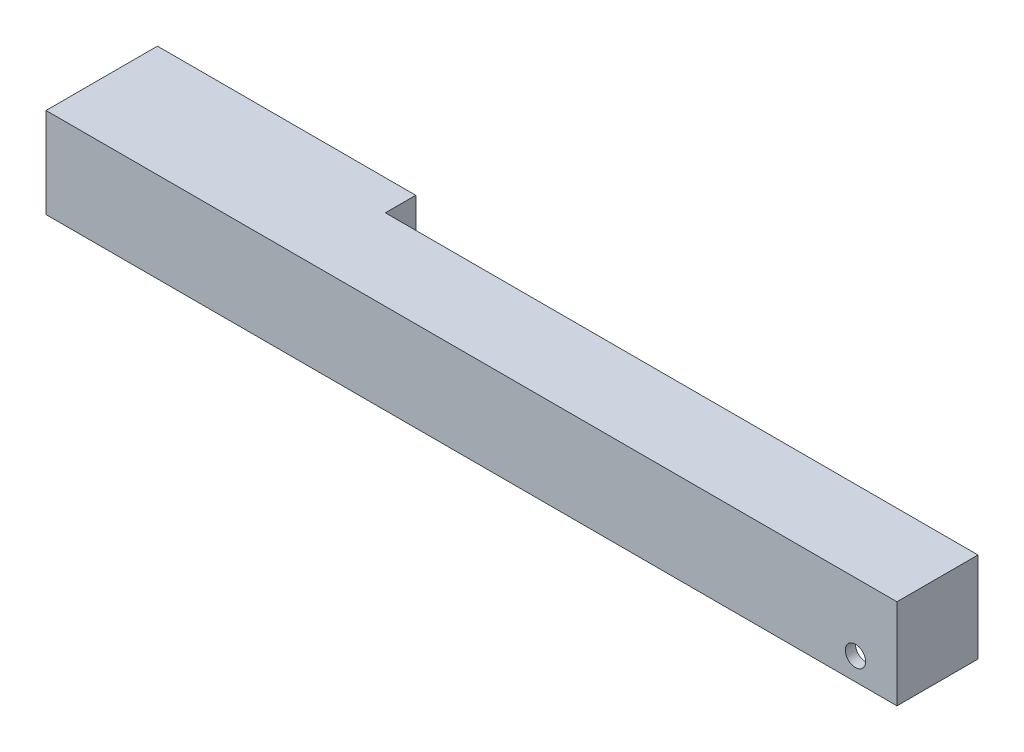
ISO-10303-21;
HEADER;
FILE_DESCRIPTION(('STEP AP214'),'2;1');
FILE_NAME('part.step','',(''),(''),'','','');
FILE_SCHEMA(('AUTOMOTIVE_DESIGN { 1 0 10303 214 1 1 1 1 }'));
ENDSEC;
DATA;
#1=APPLICATION_CONTEXT('core data for automotive mechanical design processes');
#2=APPLICATION_PROTOCOL_DEFINITION('international standard','automotive_design',2000,#1);
#3=PRODUCT_CONTEXT('',#1,'mechanical');
#4=PRODUCT('Part','Part','',(#3));
#5=PRODUCT_RELATED_PRODUCT_CATEGORY('part','',(#4));
#6=PRODUCT_DEFINITION_FORMATION('','',#4);
#7=PRODUCT_DEFINITION_CONTEXT('part definition',#1,'design');
#8=PRODUCT_DEFINITION('design','',#6,#7);
#9=PRODUCT_DEFINITION_SHAPE('','',#8);
#10=(LENGTH_UNIT() NAMED_UNIT(*) SI_UNIT(.MILLI.,.METRE.));
#11=(NAMED_UNIT(*) PLANE_ANGLE_UNIT() SI_UNIT($,.RADIAN.));
#12=(NAMED_UNIT(*) SI_UNIT($,.STERADIAN.) SOLID_ANGLE_UNIT());
#13=UNCERTAINTY_MEASURE_WITH_UNIT(LENGTH_MEASURE(1.E-05),#10,'distance_accuracy_value','');
#14=(GEOMETRIC_REPRESENTATION_CONTEXT(3) GLOBAL_UNCERTAINTY_ASSIGNED_CONTEXT((#13)) GLOBAL_UNIT_ASSIGNED_CONTEXT((#10,
#11,#12)) REPRESENTATION_CONTEXT('',''));
#15=CARTESIAN_POINT('',(0.,0.,0.));
#16=DIRECTION('',(0.,0.,1.));
#17=DIRECTION('',(1.,0.,0.));
#18=AXIS2_PLACEMENT_3D('',#15,#16,#17);
#19=CARTESIAN_POINT('',(82.,164.984847789123,9.));
#20=DIRECTION('',(0.,0.,1.));
#21=DIRECTION('',(1.,0.,0.));
#22=AXIS2_PLACEMENT_3D('',#19,#20,#21);
#23=PLANE('',#22);
#24=CARTESIAN_POINT('',(75.8000000000001,-13.35,9.));
#25=DIRECTION('',(0.,0.,1.));
#26=DIRECTION('',(1.,0.,0.));
#27=AXIS2_PLACEMENT_3D('',#24,#25,#26);
#28=CIRCLE('',#27,2.);
#29=CARTESIAN_POINT('',(77.8000000000001,-13.35,9.));
#30=VERTEX_POINT('',#29);
#31=EDGE_CURVE('E204',#30,#30,#28,.F.);
#32=ORIENTED_EDGE('',*,*,#31,.F.);
#33=EDGE_LOOP('',(#32));
#34=FACE_BOUND('',#33,.T.);
#35=DIRECTION('',(1.,0.,0.));
#36=VECTOR('',#35,1.);
#37=CARTESIAN_POINT('',(-82.,-14.3,8.99999999999998));
#38=LINE('',#37,#36);
#39=CARTESIAN_POINT('',(-82.,-14.3,8.99999999999998));
#40=VERTEX_POINT('',#39);
#41=CARTESIAN_POINT('',(-35.,-14.3,8.99999999999999));
#42=VERTEX_POINT('',#41);
#43=EDGE_CURVE('E63',#40,#42,#38,.T.);
#44=ORIENTED_EDGE('',*,*,#43,.T.);
#45=DIRECTION('',(0.,1.,0.));
#46=VECTOR('',#45,1.);
#47=CARTESIAN_POINT('',(-35.,-12.3,8.99999999999999));
#48=LINE('',#47,#46);
#49=CARTESIAN_POINT('',(-35.,-12.3,8.99999999999999));
#50=VERTEX_POINT('',#49);
#51=EDGE_CURVE('E67',#42,#50,#48,.T.);
#52=ORIENTED_EDGE('',*,*,#51,.T.);
#53=DIRECTION('',(-1.,0.,0.));
#54=VECTOR('',#53,1.);
#55=CARTESIAN_POINT('',(-82.,-12.3,8.99999999999998));
#56=LINE('',#55,#54);
#57=CARTESIAN_POINT('',(-82.,-12.3,8.99999999999998));
#58=VERTEX_POINT('',#57);
#59=EDGE_CURVE('E187',#50,#58,#56,.T.);
#60=ORIENTED_EDGE('',*,*,#59,.T.);
#61=DIRECTION('',(0.,-1.,0.));
#62=VECTOR('',#61,1.);
#63=CARTESIAN_POINT('',(-82.,164.984847789123,8.99999999999998));
#64=LINE('',#63,#62);
#65=CARTESIAN_POINT('',(-82.,-2.,8.99999999999998));
#66=VERTEX_POINT('',#65);
#67=EDGE_CURVE('E208',#66,#58,#64,.T.);
#68=ORIENTED_EDGE('',*,*,#67,.F.);
#69=DIRECTION('',(-1.,0.,0.));
#70=VECTOR('',#69,1.);
#71=CARTESIAN_POINT('',(82.,-2.,9.));
#72=LINE('',#71,#70);
#73=CARTESIAN_POINT('',(82.,-2.,9.));
#74=VERTEX_POINT('',#73);
#75=EDGE_CURVE('E297',#74,#66,#72,.T.);
#76=ORIENTED_EDGE('',*,*,#75,.F.);
#77=DIRECTION('',(0.,-1.,0.));
#78=VECTOR('',#77,1.);
#79=CARTESIAN_POINT('',(82.,164.984847789123,9.));
#80=LINE('',#79,#78);
#81=CARTESIAN_POINT('',(82.,-17.8,9.));
#82=VERTEX_POINT('',#81);
#83=EDGE_CURVE('E293',#74,#82,#80,.T.);
#84=ORIENTED_EDGE('',*,*,#83,.T.);
#85=DIRECTION('',(-1.,0.,0.));
#86=VECTOR('',#85,1.);
#87=CARTESIAN_POINT('',(82.,-17.8,9.));
#88=LINE('',#87,#86);
#89=CARTESIAN_POINT('',(-82.,-17.8,8.99999999999998));
#90=VERTEX_POINT('',#89);
#91=EDGE_CURVE('E316',#82,#90,#88,.T.);
#92=ORIENTED_EDGE('',*,*,#91,.T.);
#93=EDGE_CURVE('E278',#40,#90,#64,.T.);
#94=ORIENTED_EDGE('',*,*,#93,.F.);
#95=EDGE_LOOP('',(#44,#52,#60,#68,#76,#84,#92,#94));
#96=FACE_BOUND('',#95,.T.);
#97=ADVANCED_FACE('F47',(#34,#96),#23,.F.);
#98=CARTESIAN_POINT('',(-82.,164.984847789123,8.99999999999998));
#99=DIRECTION('',(-1.,0.,0.));
#100=DIRECTION('',(0.,0.,1.));
#101=AXIS2_PLACEMENT_3D('',#98,#99,#100);
#102=PLANE('',#101);
#103=DIRECTION('',(0.,0.,-1.));
#104=VECTOR('',#103,1.);
#105=CARTESIAN_POINT('',(-82.,-14.3,56.0425339453563));
#106=LINE('',#105,#104);
#107=CARTESIAN_POINT('',(-82.,-14.3,-9.));
#108=VERTEX_POINT('',#107);
#109=EDGE_CURVE('E341',#40,#108,#106,.T.);
#110=ORIENTED_EDGE('',*,*,#109,.F.);
#111=ORIENTED_EDGE('',*,*,#93,.T.);
#112=DIRECTION('',(0.,0.,-1.));
#113=VECTOR('',#112,1.);
#114=CARTESIAN_POINT('',(-82.,-17.8,8.99999999999998));
#115=LINE('',#114,#113);
#116=CARTESIAN_POINT('',(-82.,-17.8,-9.));
#117=VERTEX_POINT('',#116);
#118=EDGE_CURVE('E320',#90,#117,#115,.T.);
#119=ORIENTED_EDGE('',*,*,#118,.T.);
#120=DIRECTION('',(0.,-1.,0.));
#121=VECTOR('',#120,1.);
#122=CARTESIAN_POINT('',(-82.,164.984847789123,-9.));
#123=LINE('',#122,#121);
#124=EDGE_CURVE('E281',#108,#117,#123,.T.);
#125=ORIENTED_EDGE('',*,*,#124,.F.);
#126=EDGE_LOOP('',(#110,#111,#119,#125));
#127=FACE_BOUND('',#126,.T.);
#128=ADVANCED_FACE('F368',(#127),#102,.F.);
#129=DIRECTION('',(0.,0.,-1.));
#130=VECTOR('',#129,1.);
#131=CARTESIAN_POINT('',(-82.,-12.3,56.0425339453563));
#132=LINE('',#131,#130);
#133=CARTESIAN_POINT('',(-82.,-12.3,-9.));
#134=VERTEX_POINT('',#133);
#135=EDGE_CURVE('E338',#58,#134,#132,.T.);
#136=ORIENTED_EDGE('',*,*,#135,.T.);
#137=CARTESIAN_POINT('',(-82.,-2.,-9.));
#138=VERTEX_POINT('',#137);
#139=EDGE_CURVE('E183',#138,#134,#123,.T.);
#140=ORIENTED_EDGE('',*,*,#139,.F.);
#141=DIRECTION('',(0.,0.,-1.));
#142=VECTOR('',#141,1.);
#143=CARTESIAN_POINT('',(-82.,-2.,8.99999999999998));
#144=LINE('',#143,#142);
#145=EDGE_CURVE('E311',#66,#138,#144,.T.);
#146=ORIENTED_EDGE('',*,*,#145,.F.);
#147=ORIENTED_EDGE('',*,*,#67,.T.);
#148=EDGE_LOOP('',(#136,#140,#146,#147));
#149=FACE_BOUND('',#148,.T.);
#150=ADVANCED_FACE('F395',(#149),#102,.F.);
#151=CARTESIAN_POINT('',(-82.,164.984847789123,-9.));
#152=DIRECTION('',(0.,0.,-1.));
#153=DIRECTION('',(-1.,0.,0.));
#154=AXIS2_PLACEMENT_3D('',#151,#152,#153);
#155=PLANE('',#154);
#156=DIRECTION('',(1.,0.,0.));
#157=VECTOR('',#156,1.);
#158=CARTESIAN_POINT('',(-82.,-14.3,-9.));
#159=LINE('',#158,#157);
#160=CARTESIAN_POINT('',(-35.,-14.3,-9.));
#161=VERTEX_POINT('',#160);
#162=EDGE_CURVE('E348',#108,#161,#159,.T.);
#163=ORIENTED_EDGE('',*,*,#162,.F.);
#164=ORIENTED_EDGE('',*,*,#124,.T.);
#165=DIRECTION('',(1.,0.,0.));
#166=VECTOR('',#165,1.);
#167=CARTESIAN_POINT('',(-82.,-17.8,-9.));
#168=LINE('',#167,#166);
#169=CARTESIAN_POINT('',(-35.,-17.8,-9.));
#170=VERTEX_POINT('',#169);
#171=EDGE_CURVE('E324',#117,#170,#168,.T.);
#172=ORIENTED_EDGE('',*,*,#171,.T.);
#173=DIRECTION('',(0.,-1.,0.));
#174=VECTOR('',#173,1.);
#175=CARTESIAN_POINT('',(-35.,164.984847789123,-9.));
#176=LINE('',#175,#174);
#177=EDGE_CURVE('E176',#161,#170,#176,.T.);
#178=ORIENTED_EDGE('',*,*,#177,.F.);
#179=EDGE_LOOP('',(#163,#164,#172,#178));
#180=FACE_BOUND('',#179,.T.);
#181=ADVANCED_FACE('F366',(#180),#155,.F.);
#182=DIRECTION('',(-1.,0.,0.));
#183=VECTOR('',#182,1.);
#184=CARTESIAN_POINT('',(-82.,-12.3,-9.));
#185=LINE('',#184,#183);
#186=CARTESIAN_POINT('',(-35.,-12.3,-9.));
#187=VERTEX_POINT('',#186);
#188=EDGE_CURVE('E180',#187,#134,#185,.T.);
#189=ORIENTED_EDGE('',*,*,#188,.F.);
#190=CARTESIAN_POINT('',(-35.,-2.,-9.));
#191=VERTEX_POINT('',#190);
#192=EDGE_CURVE('E165',#191,#187,#176,.T.);
#193=ORIENTED_EDGE('',*,*,#192,.F.);
#194=DIRECTION('',(1.,0.,0.));
#195=VECTOR('',#194,1.);
#196=CARTESIAN_POINT('',(-82.,-2.,-9.));
#197=LINE('',#196,#195);
#198=EDGE_CURVE('E280',#138,#191,#197,.T.);
#199=ORIENTED_EDGE('',*,*,#198,.F.);
#200=ORIENTED_EDGE('',*,*,#139,.T.);
#201=EDGE_LOOP('',(#189,#193,#199,#200));
#202=FACE_BOUND('',#201,.T.);
#203=ADVANCED_FACE('F181',(#202),#155,.F.);
#204=CARTESIAN_POINT('',(-35.,164.984847789123,-9.));
#205=DIRECTION('',(1.,0.,0.));
#206=DIRECTION('',(0.,0.,-1.));
#207=AXIS2_PLACEMENT_3D('',#204,#205,#206);
#208=PLANE('',#207);
#209=DIRECTION('',(0.,0.,1.));
#210=VECTOR('',#209,1.);
#211=CARTESIAN_POINT('',(-35.,-14.3,-9.));
#212=LINE('',#211,#210);
#213=CARTESIAN_POINT('',(-35.,-14.3,-3.));
#214=VERTEX_POINT('',#213);
#215=EDGE_CURVE('E12',#161,#214,#212,.T.);
#216=ORIENTED_EDGE('',*,*,#215,.F.);
#217=ORIENTED_EDGE('',*,*,#177,.T.);
#218=DIRECTION('',(0.,0.,1.));
#219=VECTOR('',#218,1.);
#220=CARTESIAN_POINT('',(-35.,-17.8,-9.));
#221=LINE('',#220,#219);
#222=CARTESIAN_POINT('',(-35.,-17.8,-3.));
#223=VERTEX_POINT('',#222);
#224=EDGE_CURVE('E328',#170,#223,#221,.T.);
#225=ORIENTED_EDGE('',*,*,#224,.T.);
#226=DIRECTION('',(0.,-1.,0.));
#227=VECTOR('',#226,1.);
#228=CARTESIAN_POINT('',(-35.,164.984847789123,-3.));
#229=LINE('',#228,#227);
#230=EDGE_CURVE('E288',#214,#223,#229,.T.);
#231=ORIENTED_EDGE('',*,*,#230,.F.);
#232=EDGE_LOOP('',(#216,#217,#225,#231));
#233=FACE_BOUND('',#232,.T.);
#234=ADVANCED_FACE('F386',(#233),#208,.F.);
#235=DIRECTION('',(0.,0.,-1.));
#236=VECTOR('',#235,1.);
#237=CARTESIAN_POINT('',(-35.,-12.3,-9.));
#238=LINE('',#237,#236);
#239=CARTESIAN_POINT('',(-35.,-12.3,-3.));
#240=VERTEX_POINT('',#239);
#241=EDGE_CURVE('E56',#240,#187,#238,.T.);
#242=ORIENTED_EDGE('',*,*,#241,.F.);
#243=CARTESIAN_POINT('',(-35.,-2.,-3.));
#244=VERTEX_POINT('',#243);
#245=EDGE_CURVE('E283',#244,#240,#229,.T.);
#246=ORIENTED_EDGE('',*,*,#245,.F.);
#247=DIRECTION('',(0.,0.,1.));
#248=VECTOR('',#247,1.);
#249=CARTESIAN_POINT('',(-35.,-2.,-9.));
#250=LINE('',#249,#248);
#251=EDGE_CURVE('E172',#191,#244,#250,.T.);
#252=ORIENTED_EDGE('',*,*,#251,.F.);
#253=ORIENTED_EDGE('',*,*,#192,.T.);
#254=EDGE_LOOP('',(#242,#246,#252,#253));
#255=FACE_BOUND('',#254,.T.);
#256=ADVANCED_FACE('F167',(#255),#208,.F.);
#257=CARTESIAN_POINT('',(75.8000000000001,-13.35,-16.6568542494924));
#258=DIRECTION('',(0.,0.,1.));
#259=DIRECTION('',(1.,0.,0.));
#260=AXIS2_PLACEMENT_3D('',#257,#258,#259);
#261=CYLINDRICAL_SURFACE('',#260,2.);
#262=CARTESIAN_POINT('',(75.8000000000001,-13.35,-3.));
#263=DIRECTION('',(0.,0.,-1.));
#264=DIRECTION('',(-1.,0.,0.));
#265=AXIS2_PLACEMENT_3D('',#262,#263,#264);
#266=CIRCLE('',#265,2.);
#267=CARTESIAN_POINT('',(73.8000000000001,-13.35,-3.));
#268=VERTEX_POINT('',#267);
#269=EDGE_CURVE('E199',#268,#268,#266,.F.);
#270=ORIENTED_EDGE('',*,*,#269,.T.);
#271=EDGE_LOOP('',(#270));
#272=FACE_BOUND('',#271,.T.);
#273=CARTESIAN_POINT('',(75.8000000000001,-13.35,-5.));
#274=DIRECTION('',(0.,0.,1.));
#275=DIRECTION('',(1.,0.,0.));
#276=AXIS2_PLACEMENT_3D('',#273,#274,#275);
#277=CIRCLE('',#276,2.);
#278=CARTESIAN_POINT('',(77.8000000000001,-13.35,-5.));
#279=VERTEX_POINT('',#278);
#280=EDGE_CURVE('E209',#279,#279,#277,.F.);
#281=ORIENTED_EDGE('',*,*,#280,.T.);
#282=EDGE_LOOP('',(#281));
#283=FACE_BOUND('',#282,.T.);
#284=ADVANCED_FACE('F455',(#272,#283),#261,.F.);
#285=CARTESIAN_POINT('',(-84.,-17.8,11.));
#286=DIRECTION('',(0.,0.,1.));
#287=DIRECTION('',(1.,0.,0.));
#288=AXIS2_PLACEMENT_3D('',#285,#286,#287);
#289=PLANE('',#288);
#290=CARTESIAN_POINT('',(75.8000000000001,-13.35,11.));
#291=DIRECTION('',(0.,0.,1.));
#292=DIRECTION('',(1.,0.,0.));
#293=AXIS2_PLACEMENT_3D('',#290,#291,#292);
#294=CIRCLE('',#293,2.);
#295=CARTESIAN_POINT('',(77.8000000000001,-13.35,11.));
#296=VERTEX_POINT('',#295);
#297=EDGE_CURVE('E213',#296,#296,#294,.T.);
#298=ORIENTED_EDGE('',*,*,#297,.F.);
#299=EDGE_LOOP('',(#298));
#300=FACE_BOUND('',#299,.T.);
#301=DIRECTION('',(1.,0.,0.));
#302=VECTOR('',#301,1.);
#303=CARTESIAN_POINT('',(-84.,0.,11.));
#304=LINE('',#303,#302);
#305=CARTESIAN_POINT('',(-84.,0.,11.));
#306=VERTEX_POINT('',#305);
#307=CARTESIAN_POINT('',(84.,0.,11.));
#308=VERTEX_POINT('',#307);
#309=EDGE_CURVE('E234',#306,#308,#304,.T.);
#310=ORIENTED_EDGE('',*,*,#309,.F.);
#311=DIRECTION('',(0.,1.,0.));
#312=VECTOR('',#311,1.);
#313=CARTESIAN_POINT('',(-84.,-17.8,11.));
#314=LINE('',#313,#312);
#315=CARTESIAN_POINT('',(-84.,-17.8,11.));
#316=VERTEX_POINT('',#315);
#317=EDGE_CURVE('E194',#316,#306,#314,.T.);
#318=ORIENTED_EDGE('',*,*,#317,.F.);
#319=DIRECTION('',(1.,0.,0.));
#320=VECTOR('',#319,1.);
#321=CARTESIAN_POINT('',(-84.,-17.8,11.));
#322=LINE('',#321,#320);
#323=CARTESIAN_POINT('',(84.,-17.8,11.));
#324=VERTEX_POINT('',#323);
#325=EDGE_CURVE('E225',#316,#324,#322,.T.);
#326=ORIENTED_EDGE('',*,*,#325,.T.);
#327=DIRECTION('',(0.,1.,0.));
#328=VECTOR('',#327,1.);
#329=CARTESIAN_POINT('',(84.,-17.8,11.));
#330=LINE('',#329,#328);
#331=EDGE_CURVE('E215',#324,#308,#330,.T.);
#332=ORIENTED_EDGE('',*,*,#331,.T.);
#333=EDGE_LOOP('',(#310,#318,#326,#332));
#334=FACE_BOUND('',#333,.T.);
#335=ADVANCED_FACE('F49',(#300,#334),#289,.T.);
#336=CARTESIAN_POINT('',(-84.,-17.8,11.));
#337=DIRECTION('',(1.,0.,0.));
#338=DIRECTION('',(0.,0.,-1.));
#339=AXIS2_PLACEMENT_3D('',#336,#337,#338);
#340=PLANE('',#339);
#341=DIRECTION('',(0.,0.,-1.));
#342=VECTOR('',#341,1.);
#343=CARTESIAN_POINT('',(-84.,0.,11.));
#344=LINE('',#343,#342);
#345=CARTESIAN_POINT('',(-84.,0.,-11.));
#346=VERTEX_POINT('',#345);
#347=EDGE_CURVE('E222',#306,#346,#344,.T.);
#348=ORIENTED_EDGE('',*,*,#347,.T.);
#349=DIRECTION('',(0.,1.,0.));
#350=VECTOR('',#349,1.);
#351=CARTESIAN_POINT('',(-84.,-17.8,-11.));
#352=LINE('',#351,#350);
#353=CARTESIAN_POINT('',(-84.,-17.8,-11.));
#354=VERTEX_POINT('',#353);
#355=EDGE_CURVE('E196',#354,#346,#352,.T.);
#356=ORIENTED_EDGE('',*,*,#355,.F.);
#357=DIRECTION('',(0.,0.,-1.));
#358=VECTOR('',#357,1.);
#359=CARTESIAN_POINT('',(-84.,-17.8,11.));
#360=LINE('',#359,#358);
#361=EDGE_CURVE('E218',#316,#354,#360,.T.);
#362=ORIENTED_EDGE('',*,*,#361,.F.);
#363=ORIENTED_EDGE('',*,*,#317,.T.);
#364=EDGE_LOOP('',(#348,#356,#362,#363));
#365=FACE_BOUND('',#364,.T.);
#366=ADVANCED_FACE('F583',(#365),#340,.F.);
#367=CARTESIAN_POINT('',(-84.,-17.8,-11.));
#368=DIRECTION('',(0.,0.,1.));
#369=DIRECTION('',(1.,0.,0.));
#370=AXIS2_PLACEMENT_3D('',#367,#368,#369);
#371=PLANE('',#370);
#372=DIRECTION('',(1.,0.,0.));
#373=VECTOR('',#372,1.);
#374=CARTESIAN_POINT('',(-84.,0.,-11.));
#375=LINE('',#374,#373);
#376=CARTESIAN_POINT('',(-33.,0.,-11.));
#377=VERTEX_POINT('',#376);
#378=EDGE_CURVE('E226',#346,#377,#375,.T.);
#379=ORIENTED_EDGE('',*,*,#378,.T.);
#380=DIRECTION('',(0.,1.,0.));
#381=VECTOR('',#380,1.);
#382=CARTESIAN_POINT('',(-33.,-134.9537451386,-11.));
#383=LINE('',#382,#381);
#384=CARTESIAN_POINT('',(-33.,-17.8,-11.));
#385=VERTEX_POINT('',#384);
#386=EDGE_CURVE('E254',#385,#377,#383,.T.);
#387=ORIENTED_EDGE('',*,*,#386,.F.);
#388=DIRECTION('',(1.,0.,0.));
#389=VECTOR('',#388,1.);
#390=CARTESIAN_POINT('',(-84.,-17.8,-11.));
#391=LINE('',#390,#389);
#392=EDGE_CURVE('E240',#354,#385,#391,.T.);
#393=ORIENTED_EDGE('',*,*,#392,.F.);
#394=ORIENTED_EDGE('',*,*,#355,.T.);
#395=EDGE_LOOP('',(#379,#387,#393,#394));
#396=FACE_BOUND('',#395,.T.);
#397=ADVANCED_FACE('F573',(#396),#371,.F.);
#398=CARTESIAN_POINT('',(84.,-17.8,11.));
#399=DIRECTION('',(1.,0.,0.));
#400=DIRECTION('',(0.,0.,-1.));
#401=AXIS2_PLACEMENT_3D('',#398,#399,#400);
#402=PLANE('',#401);
#403=DIRECTION('',(0.,1.,0.));
#404=VECTOR('',#403,1.);
#405=CARTESIAN_POINT('',(84.,-134.9537451386,-5.));
#406=LINE('',#405,#404);
#407=CARTESIAN_POINT('',(84.,-17.8,-5.));
#408=VERTEX_POINT('',#407);
#409=CARTESIAN_POINT('',(84.,0.,-5.));
#410=VERTEX_POINT('',#409);
#411=EDGE_CURVE('E261',#408,#410,#406,.T.);
#412=ORIENTED_EDGE('',*,*,#411,.T.);
#413=DIRECTION('',(0.,0.,-1.));
#414=VECTOR('',#413,1.);
#415=CARTESIAN_POINT('',(84.,0.,11.));
#416=LINE('',#415,#414);
#417=EDGE_CURVE('E230',#308,#410,#416,.T.);
#418=ORIENTED_EDGE('',*,*,#417,.F.);
#419=ORIENTED_EDGE('',*,*,#331,.F.);
#420=DIRECTION('',(0.,0.,-1.));
#421=VECTOR('',#420,1.);
#422=CARTESIAN_POINT('',(84.,-17.8,11.));
#423=LINE('',#422,#421);
#424=EDGE_CURVE('E244',#324,#408,#423,.T.);
#425=ORIENTED_EDGE('',*,*,#424,.T.);
#426=EDGE_LOOP('',(#412,#418,#419,#425));
#427=FACE_BOUND('',#426,.T.);
#428=ADVANCED_FACE('F531',(#427),#402,.T.);
#429=CARTESIAN_POINT('',(0.,-17.8,0.));
#430=DIRECTION('',(0.,1.,0.));
#431=DIRECTION('',(0.,0.,1.));
#432=AXIS2_PLACEMENT_3D('',#429,#430,#431);
#433=PLANE('',#432);
#434=ORIENTED_EDGE('',*,*,#171,.F.);
#435=ORIENTED_EDGE('',*,*,#118,.F.);
#436=ORIENTED_EDGE('',*,*,#91,.F.);
#437=DIRECTION('',(0.,0.,1.));
#438=VECTOR('',#437,1.);
#439=CARTESIAN_POINT('',(82.,-17.8,-3.));
#440=LINE('',#439,#438);
#441=CARTESIAN_POINT('',(82.,-17.8,-3.));
#442=VERTEX_POINT('',#441);
#443=EDGE_CURVE('E315',#442,#82,#440,.T.);
#444=ORIENTED_EDGE('',*,*,#443,.F.);
#445=DIRECTION('',(1.,0.,0.));
#446=VECTOR('',#445,1.);
#447=CARTESIAN_POINT('',(-35.,-17.8,-3.));
#448=LINE('',#447,#446);
#449=EDGE_CURVE('E332',#223,#442,#448,.T.);
#450=ORIENTED_EDGE('',*,*,#449,.F.);
#451=ORIENTED_EDGE('',*,*,#224,.F.);
#452=EDGE_LOOP('',(#434,#435,#436,#444,#450,#451));
#453=FACE_BOUND('',#452,.T.);
#454=DIRECTION('',(0.,0.,-1.));
#455=VECTOR('',#454,1.);
#456=CARTESIAN_POINT('',(-33.,-17.8,-11.));
#457=LINE('',#456,#455);
#458=CARTESIAN_POINT('',(-33.,-17.8,-5.));
#459=VERTEX_POINT('',#458);
#460=EDGE_CURVE('E265',#459,#385,#457,.T.);
#461=ORIENTED_EDGE('',*,*,#460,.F.);
#462=DIRECTION('',(-1.,0.,0.));
#463=VECTOR('',#462,1.);
#464=CARTESIAN_POINT('',(-33.,-17.8,-5.));
#465=LINE('',#464,#463);
#466=EDGE_CURVE('E214',#408,#459,#465,.T.);
#467=ORIENTED_EDGE('',*,*,#466,.F.);
#468=ORIENTED_EDGE('',*,*,#424,.F.);
#469=ORIENTED_EDGE('',*,*,#325,.F.);
#470=ORIENTED_EDGE('',*,*,#361,.T.);
#471=ORIENTED_EDGE('',*,*,#392,.T.);
#472=EDGE_LOOP('',(#461,#467,#468,#469,#470,#471));
#473=FACE_BOUND('',#472,.T.);
#474=ADVANCED_FACE('F381',(#453,#473),#433,.F.);
#475=CARTESIAN_POINT('',(0.,0.,0.));
#476=DIRECTION('',(0.,1.,0.));
#477=DIRECTION('',(0.,0.,1.));
#478=AXIS2_PLACEMENT_3D('',#475,#476,#477);
#479=PLANE('',#478);
#480=DIRECTION('',(1.,0.,0.));
#481=VECTOR('',#480,1.);
#482=CARTESIAN_POINT('',(-33.,0.,-5.));
#483=LINE('',#482,#481);
#484=CARTESIAN_POINT('',(-33.,0.,-5.));
#485=VERTEX_POINT('',#484);
#486=EDGE_CURVE('E258',#485,#410,#483,.T.);
#487=ORIENTED_EDGE('',*,*,#486,.F.);
#488=DIRECTION('',(0.,0.,1.));
#489=VECTOR('',#488,1.);
#490=CARTESIAN_POINT('',(-33.,0.,-11.));
#491=LINE('',#490,#489);
#492=EDGE_CURVE('E203',#377,#485,#491,.T.);
#493=ORIENTED_EDGE('',*,*,#492,.F.);
#494=ORIENTED_EDGE('',*,*,#378,.F.);
#495=ORIENTED_EDGE('',*,*,#347,.F.);
#496=ORIENTED_EDGE('',*,*,#309,.T.);
#497=ORIENTED_EDGE('',*,*,#417,.T.);
#498=EDGE_LOOP('',(#487,#493,#494,#495,#496,#497));
#499=FACE_BOUND('',#498,.T.);
#500=ADVANCED_FACE('F516',(#499),#479,.T.);
#501=ORIENTED_EDGE('',*,*,#31,.T.);
#502=EDGE_LOOP('',(#501));
#503=FACE_BOUND('',#502,.T.);
#504=ORIENTED_EDGE('',*,*,#297,.T.);
#505=EDGE_LOOP('',(#504));
#506=FACE_BOUND('',#505,.T.);
#507=ADVANCED_FACE('F510',(#503,#506),#261,.F.);
#508=CARTESIAN_POINT('',(-33.,-134.9537451386,-5.));
#509=DIRECTION('',(0.,0.,1.));
#510=DIRECTION('',(1.,0.,0.));
#511=AXIS2_PLACEMENT_3D('',#508,#509,#510);
#512=PLANE('',#511);
#513=ORIENTED_EDGE('',*,*,#466,.T.);
#514=DIRECTION('',(0.,1.,0.));
#515=VECTOR('',#514,1.);
#516=CARTESIAN_POINT('',(-33.,-134.9537451386,-5.));
#517=LINE('',#516,#515);
#518=EDGE_CURVE('E257',#459,#485,#517,.T.);
#519=ORIENTED_EDGE('',*,*,#518,.T.);
#520=ORIENTED_EDGE('',*,*,#486,.T.);
#521=ORIENTED_EDGE('',*,*,#411,.F.);
#522=EDGE_LOOP('',(#513,#519,#520,#521));
#523=FACE_BOUND('',#522,.T.);
#524=ORIENTED_EDGE('',*,*,#280,.F.);
#525=EDGE_LOOP('',(#524));
#526=FACE_BOUND('',#525,.T.);
#527=ADVANCED_FACE('F515',(#523,#526),#512,.F.);
#528=CARTESIAN_POINT('',(-33.,-134.9537451386,-11.));
#529=DIRECTION('',(-1.,0.,0.));
#530=DIRECTION('',(0.,0.,1.));
#531=AXIS2_PLACEMENT_3D('',#528,#529,#530);
#532=PLANE('',#531);
#533=ORIENTED_EDGE('',*,*,#460,.T.);
#534=ORIENTED_EDGE('',*,*,#386,.T.);
#535=ORIENTED_EDGE('',*,*,#492,.T.);
#536=ORIENTED_EDGE('',*,*,#518,.F.);
#537=EDGE_LOOP('',(#533,#534,#535,#536));
#538=FACE_BOUND('',#537,.T.);
#539=ADVANCED_FACE('F443',(#538),#532,.F.);
#540=CARTESIAN_POINT('',(-35.,164.984847789123,-3.));
#541=DIRECTION('',(0.,0.,-1.));
#542=DIRECTION('',(-1.,0.,0.));
#543=AXIS2_PLACEMENT_3D('',#540,#541,#542);
#544=PLANE('',#543);
#545=ORIENTED_EDGE('',*,*,#245,.T.);
#546=EDGE_CURVE('E287',#240,#214,#229,.T.);
#547=ORIENTED_EDGE('',*,*,#546,.T.);
#548=ORIENTED_EDGE('',*,*,#230,.T.);
#549=ORIENTED_EDGE('',*,*,#449,.T.);
#550=DIRECTION('',(0.,-1.,0.));
#551=VECTOR('',#550,1.);
#552=CARTESIAN_POINT('',(82.,164.984847789123,-3.));
#553=LINE('',#552,#551);
#554=CARTESIAN_POINT('',(82.,-2.,-3.));
#555=VERTEX_POINT('',#554);
#556=EDGE_CURVE('E289',#555,#442,#553,.T.);
#557=ORIENTED_EDGE('',*,*,#556,.F.);
#558=DIRECTION('',(1.,0.,0.));
#559=VECTOR('',#558,1.);
#560=CARTESIAN_POINT('',(-35.,-2.,-3.));
#561=LINE('',#560,#559);
#562=EDGE_CURVE('E286',#244,#555,#561,.T.);
#563=ORIENTED_EDGE('',*,*,#562,.F.);
#564=EDGE_LOOP('',(#545,#547,#548,#549,#557,#563));
#565=FACE_BOUND('',#564,.T.);
#566=ORIENTED_EDGE('',*,*,#269,.F.);
#567=EDGE_LOOP('',(#566));
#568=FACE_BOUND('',#567,.T.);
#569=ADVANCED_FACE('F389',(#565,#568),#544,.F.);
#570=CARTESIAN_POINT('',(0.,-2.,0.));
#571=DIRECTION('',(0.,1.,0.));
#572=DIRECTION('',(0.,0.,1.));
#573=AXIS2_PLACEMENT_3D('',#570,#571,#572);
#574=PLANE('',#573);
#575=ORIENTED_EDGE('',*,*,#75,.T.);
#576=ORIENTED_EDGE('',*,*,#145,.T.);
#577=ORIENTED_EDGE('',*,*,#198,.T.);
#578=ORIENTED_EDGE('',*,*,#251,.T.);
#579=ORIENTED_EDGE('',*,*,#562,.T.);
#580=DIRECTION('',(0.,0.,1.));
#581=VECTOR('',#580,1.);
#582=CARTESIAN_POINT('',(82.,-2.,-3.));
#583=LINE('',#582,#581);
#584=EDGE_CURVE('E292',#555,#74,#583,.T.);
#585=ORIENTED_EDGE('',*,*,#584,.T.);
#586=EDGE_LOOP('',(#575,#576,#577,#578,#579,#585));
#587=FACE_BOUND('',#586,.T.);
#588=ADVANCED_FACE('F397',(#587),#574,.F.);
#589=CARTESIAN_POINT('',(82.,164.984847789123,-3.));
#590=DIRECTION('',(1.,0.,0.));
#591=DIRECTION('',(0.,0.,-1.));
#592=AXIS2_PLACEMENT_3D('',#589,#590,#591);
#593=PLANE('',#592);
#594=ORIENTED_EDGE('',*,*,#556,.T.);
#595=ORIENTED_EDGE('',*,*,#443,.T.);
#596=ORIENTED_EDGE('',*,*,#83,.F.);
#597=ORIENTED_EDGE('',*,*,#584,.F.);
#598=EDGE_LOOP('',(#594,#595,#596,#597));
#599=FACE_BOUND('',#598,.T.);
#600=ADVANCED_FACE('F399',(#599),#593,.F.);
#601=CARTESIAN_POINT('',(-35.,-12.3,56.0425339453563));
#602=DIRECTION('',(-1.,0.,0.));
#603=DIRECTION('',(0.,0.,1.));
#604=AXIS2_PLACEMENT_3D('',#601,#602,#603);
#605=PLANE('',#604);
#606=DIRECTION('',(0.,0.,-1.));
#607=VECTOR('',#606,1.);
#608=CARTESIAN_POINT('',(-35.,-14.3,56.0425339453563));
#609=LINE('',#608,#607);
#610=EDGE_CURVE('E344',#42,#214,#609,.T.);
#611=ORIENTED_EDGE('',*,*,#610,.T.);
#612=ORIENTED_EDGE('',*,*,#546,.F.);
#613=DIRECTION('',(0.,0.,-1.));
#614=VECTOR('',#613,1.);
#615=CARTESIAN_POINT('',(-35.,-12.3,56.0425339453563));
#616=LINE('',#615,#614);
#617=EDGE_CURVE('E188',#50,#240,#616,.T.);
#618=ORIENTED_EDGE('',*,*,#617,.F.);
#619=ORIENTED_EDGE('',*,*,#51,.F.);
#620=EDGE_LOOP('',(#611,#612,#618,#619));
#621=FACE_BOUND('',#620,.T.);
#622=ADVANCED_FACE('F392',(#621),#605,.F.);
#623=CARTESIAN_POINT('',(-82.,-14.3,56.0425339453563));
#624=DIRECTION('',(0.,1.,0.));
#625=DIRECTION('',(0.,0.,1.));
#626=AXIS2_PLACEMENT_3D('',#623,#624,#625);
#627=PLANE('',#626);
#628=ORIENTED_EDGE('',*,*,#43,.F.);
#629=ORIENTED_EDGE('',*,*,#109,.T.);
#630=ORIENTED_EDGE('',*,*,#162,.T.);
#631=ORIENTED_EDGE('',*,*,#215,.T.);
#632=ORIENTED_EDGE('',*,*,#610,.F.);
#633=EDGE_LOOP('',(#628,#629,#630,#631,#632));
#634=FACE_BOUND('',#633,.T.);
#635=ADVANCED_FACE('F361',(#634),#627,.F.);
#636=CARTESIAN_POINT('',(-82.,-12.3,56.0425339453563));
#637=DIRECTION('',(0.,-1.,0.));
#638=DIRECTION('',(0.,0.,-1.));
#639=AXIS2_PLACEMENT_3D('',#636,#637,#638);
#640=PLANE('',#639);
#641=ORIENTED_EDGE('',*,*,#59,.F.);
#642=ORIENTED_EDGE('',*,*,#617,.T.);
#643=ORIENTED_EDGE('',*,*,#241,.T.);
#644=ORIENTED_EDGE('',*,*,#188,.T.);
#645=ORIENTED_EDGE('',*,*,#135,.F.);
#646=EDGE_LOOP('',(#641,#642,#643,#644,#645));
#647=FACE_BOUND('',#646,.T.);
#648=ADVANCED_FACE('F192',(#647),#640,.F.);
#649=CLOSED_SHELL('',(#97,#128,#150,#181,#203,#234,#256,#284,#335,#366,#397,#428,#474,#500,#507,
#527,#539,#569,#588,#600,#622,#635,#648));
#650=MANIFOLD_SOLID_BREP('B2',#649);
#651=ADVANCED_BREP_SHAPE_REPRESENTATION('',(#18,#650),#14);
#652=SHAPE_DEFINITION_REPRESENTATION(#9,#651);
ENDSEC;
END-ISO-10303-21;
